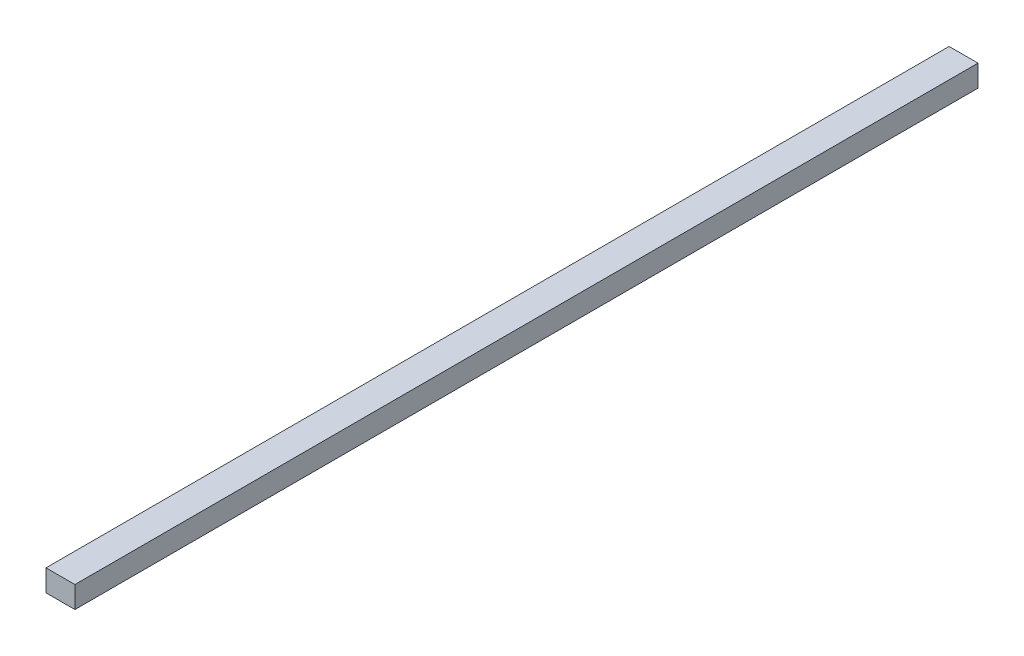
ISO-10303-21;
HEADER;
FILE_DESCRIPTION(('STEP AP214'),'2;1');
FILE_NAME('part.step','',(''),(''),'','','');
FILE_SCHEMA(('AUTOMOTIVE_DESIGN { 1 0 10303 214 1 1 1 1 }'));
ENDSEC;
DATA;
#1=APPLICATION_CONTEXT('core data for automotive mechanical design processes');
#2=APPLICATION_PROTOCOL_DEFINITION('international standard','automotive_design',2000,#1);
#3=PRODUCT_CONTEXT('',#1,'mechanical');
#4=PRODUCT('Part','Part','',(#3));
#5=PRODUCT_RELATED_PRODUCT_CATEGORY('part','',(#4));
#6=PRODUCT_DEFINITION_FORMATION('','',#4);
#7=PRODUCT_DEFINITION_CONTEXT('part definition',#1,'design');
#8=PRODUCT_DEFINITION('design','',#6,#7);
#9=PRODUCT_DEFINITION_SHAPE('','',#8);
#10=(LENGTH_UNIT() NAMED_UNIT(*) SI_UNIT(.MILLI.,.METRE.));
#11=(NAMED_UNIT(*) PLANE_ANGLE_UNIT() SI_UNIT($,.RADIAN.));
#12=(NAMED_UNIT(*) SI_UNIT($,.STERADIAN.) SOLID_ANGLE_UNIT());
#13=UNCERTAINTY_MEASURE_WITH_UNIT(LENGTH_MEASURE(1.E-05),#10,'distance_accuracy_value','');
#14=(GEOMETRIC_REPRESENTATION_CONTEXT(3) GLOBAL_UNCERTAINTY_ASSIGNED_CONTEXT((#13)) GLOBAL_UNIT_ASSIGNED_CONTEXT((#10,
#11,#12)) REPRESENTATION_CONTEXT('',''));
#15=CARTESIAN_POINT('',(0.,0.,0.));
#16=DIRECTION('',(0.,0.,1.));
#17=DIRECTION('',(1.,0.,0.));
#18=AXIS2_PLACEMENT_3D('',#15,#16,#17);
#19=CARTESIAN_POINT('',(290.,1176.,-550.));
#20=DIRECTION('',(-1.,0.,0.));
#21=DIRECTION('',(0.,0.,1.));
#22=AXIS2_PLACEMENT_3D('',#19,#20,#21);
#23=PLANE('',#22);
#24=DIRECTION('',(0.,-1.,0.));
#25=VECTOR('',#24,1.);
#26=CARTESIAN_POINT('',(290.,1176.,-50.));
#27=LINE('',#26,#25);
#28=CARTESIAN_POINT('',(290.,1188.,-50.));
#29=VERTEX_POINT('',#28);
#30=CARTESIAN_POINT('',(290.,1176.,-50.));
#31=VERTEX_POINT('',#30);
#32=EDGE_CURVE('E103',#29,#31,#27,.T.);
#33=ORIENTED_EDGE('',*,*,#32,.F.);
#34=DIRECTION('',(0.,0.,1.));
#35=VECTOR('',#34,1.);
#36=CARTESIAN_POINT('',(290.,1188.,-550.));
#37=LINE('',#36,#35);
#38=CARTESIAN_POINT('',(290.,1188.,-550.));
#39=VERTEX_POINT('',#38);
#40=EDGE_CURVE('E11',#39,#29,#37,.T.);
#41=ORIENTED_EDGE('',*,*,#40,.F.);
#42=DIRECTION('',(0.,-1.,0.));
#43=VECTOR('',#42,1.);
#44=CARTESIAN_POINT('',(290.,1176.,-550.));
#45=LINE('',#44,#43);
#46=CARTESIAN_POINT('',(290.,1176.,-550.));
#47=VERTEX_POINT('',#46);
#48=EDGE_CURVE('E97',#39,#47,#45,.T.);
#49=ORIENTED_EDGE('',*,*,#48,.T.);
#50=DIRECTION('',(0.,0.,1.));
#51=VECTOR('',#50,1.);
#52=CARTESIAN_POINT('',(290.,1176.,-550.));
#53=LINE('',#52,#51);
#54=EDGE_CURVE('E42',#47,#31,#53,.T.);
#55=ORIENTED_EDGE('',*,*,#54,.T.);
#56=EDGE_LOOP('',(#33,#41,#49,#55));
#57=FACE_BOUND('',#56,.T.);
#58=ADVANCED_FACE('F39',(#57),#23,.T.);
#59=CARTESIAN_POINT('',(290.,1188.,-550.));
#60=DIRECTION('',(0.,1.,0.));
#61=DIRECTION('',(0.,0.,1.));
#62=AXIS2_PLACEMENT_3D('',#59,#60,#61);
#63=PLANE('',#62);
#64=DIRECTION('',(-1.,0.,0.));
#65=VECTOR('',#64,1.);
#66=CARTESIAN_POINT('',(290.,1188.,-50.));
#67=LINE('',#66,#65);
#68=CARTESIAN_POINT('',(306.,1188.,-50.));
#69=VERTEX_POINT('',#68);
#70=EDGE_CURVE('E99',#69,#29,#67,.T.);
#71=ORIENTED_EDGE('',*,*,#70,.F.);
#72=DIRECTION('',(0.,0.,1.));
#73=VECTOR('',#72,1.);
#74=CARTESIAN_POINT('',(306.,1188.,-550.));
#75=LINE('',#74,#73);
#76=CARTESIAN_POINT('',(306.,1188.,-550.));
#77=VERTEX_POINT('',#76);
#78=EDGE_CURVE('E48',#77,#69,#75,.T.);
#79=ORIENTED_EDGE('',*,*,#78,.F.);
#80=DIRECTION('',(-1.,0.,0.));
#81=VECTOR('',#80,1.);
#82=CARTESIAN_POINT('',(290.,1188.,-550.));
#83=LINE('',#82,#81);
#84=EDGE_CURVE('E94',#77,#39,#83,.T.);
#85=ORIENTED_EDGE('',*,*,#84,.T.);
#86=ORIENTED_EDGE('',*,*,#40,.T.);
#87=EDGE_LOOP('',(#71,#79,#85,#86));
#88=FACE_BOUND('',#87,.T.);
#89=ADVANCED_FACE('F113',(#88),#63,.T.);
#90=CARTESIAN_POINT('',(306.,1176.,-550.));
#91=DIRECTION('',(1.,0.,0.));
#92=DIRECTION('',(0.,0.,-1.));
#93=AXIS2_PLACEMENT_3D('',#90,#91,#92);
#94=PLANE('',#93);
#95=DIRECTION('',(0.,1.,0.));
#96=VECTOR('',#95,1.);
#97=CARTESIAN_POINT('',(306.,1176.,-50.));
#98=LINE('',#97,#96);
#99=CARTESIAN_POINT('',(306.,1176.,-50.));
#100=VERTEX_POINT('',#99);
#101=EDGE_CURVE('E89',#100,#69,#98,.T.);
#102=ORIENTED_EDGE('',*,*,#101,.F.);
#103=DIRECTION('',(0.,0.,1.));
#104=VECTOR('',#103,1.);
#105=CARTESIAN_POINT('',(306.,1176.,-550.));
#106=LINE('',#105,#104);
#107=CARTESIAN_POINT('',(306.,1176.,-550.));
#108=VERTEX_POINT('',#107);
#109=EDGE_CURVE('E84',#108,#100,#106,.T.);
#110=ORIENTED_EDGE('',*,*,#109,.F.);
#111=DIRECTION('',(0.,1.,0.));
#112=VECTOR('',#111,1.);
#113=CARTESIAN_POINT('',(306.,1176.,-550.));
#114=LINE('',#113,#112);
#115=EDGE_CURVE('E87',#108,#77,#114,.T.);
#116=ORIENTED_EDGE('',*,*,#115,.T.);
#117=ORIENTED_EDGE('',*,*,#78,.T.);
#118=EDGE_LOOP('',(#102,#110,#116,#117));
#119=FACE_BOUND('',#118,.T.);
#120=ADVANCED_FACE('F86',(#119),#94,.T.);
#121=CARTESIAN_POINT('',(290.,1176.,-550.));
#122=DIRECTION('',(0.,-1.,0.));
#123=DIRECTION('',(0.,0.,-1.));
#124=AXIS2_PLACEMENT_3D('',#121,#122,#123);
#125=PLANE('',#124);
#126=DIRECTION('',(1.,0.,0.));
#127=VECTOR('',#126,1.);
#128=CARTESIAN_POINT('',(290.,1176.,-50.));
#129=LINE('',#128,#127);
#130=EDGE_CURVE('E106',#31,#100,#129,.T.);
#131=ORIENTED_EDGE('',*,*,#130,.F.);
#132=ORIENTED_EDGE('',*,*,#54,.F.);
#133=DIRECTION('',(1.,0.,0.));
#134=VECTOR('',#133,1.);
#135=CARTESIAN_POINT('',(290.,1176.,-550.));
#136=LINE('',#135,#134);
#137=EDGE_CURVE('E93',#47,#108,#136,.T.);
#138=ORIENTED_EDGE('',*,*,#137,.T.);
#139=ORIENTED_EDGE('',*,*,#109,.T.);
#140=EDGE_LOOP('',(#131,#132,#138,#139));
#141=FACE_BOUND('',#140,.T.);
#142=ADVANCED_FACE('F96',(#141),#125,.T.);
#143=CARTESIAN_POINT('',(0.,0.,-550.));
#144=DIRECTION('',(0.,0.,-1.));
#145=DIRECTION('',(-1.,0.,0.));
#146=AXIS2_PLACEMENT_3D('',#143,#144,#145);
#147=PLANE('',#146);
#148=ORIENTED_EDGE('',*,*,#48,.F.);
#149=ORIENTED_EDGE('',*,*,#84,.F.);
#150=ORIENTED_EDGE('',*,*,#115,.F.);
#151=ORIENTED_EDGE('',*,*,#137,.F.);
#152=EDGE_LOOP('',(#148,#149,#150,#151));
#153=FACE_BOUND('',#152,.T.);
#154=ADVANCED_FACE('F92',(#153),#147,.T.);
#155=CARTESIAN_POINT('',(0.,0.,-50.));
#156=DIRECTION('',(0.,0.,-1.));
#157=DIRECTION('',(-1.,0.,0.));
#158=AXIS2_PLACEMENT_3D('',#155,#156,#157);
#159=PLANE('',#158);
#160=ORIENTED_EDGE('',*,*,#32,.T.);
#161=ORIENTED_EDGE('',*,*,#130,.T.);
#162=ORIENTED_EDGE('',*,*,#101,.T.);
#163=ORIENTED_EDGE('',*,*,#70,.T.);
#164=EDGE_LOOP('',(#160,#161,#162,#163));
#165=FACE_BOUND('',#164,.T.);
#166=ADVANCED_FACE('F112',(#165),#159,.F.);
#167=CLOSED_SHELL('',(#58,#89,#120,#142,#154,#166));
#168=MANIFOLD_SOLID_BREP('B2',#167);
#169=ADVANCED_BREP_SHAPE_REPRESENTATION('',(#18,#168),#14);
#170=SHAPE_DEFINITION_REPRESENTATION(#9,#169);
ENDSEC;
END-ISO-10303-21;
